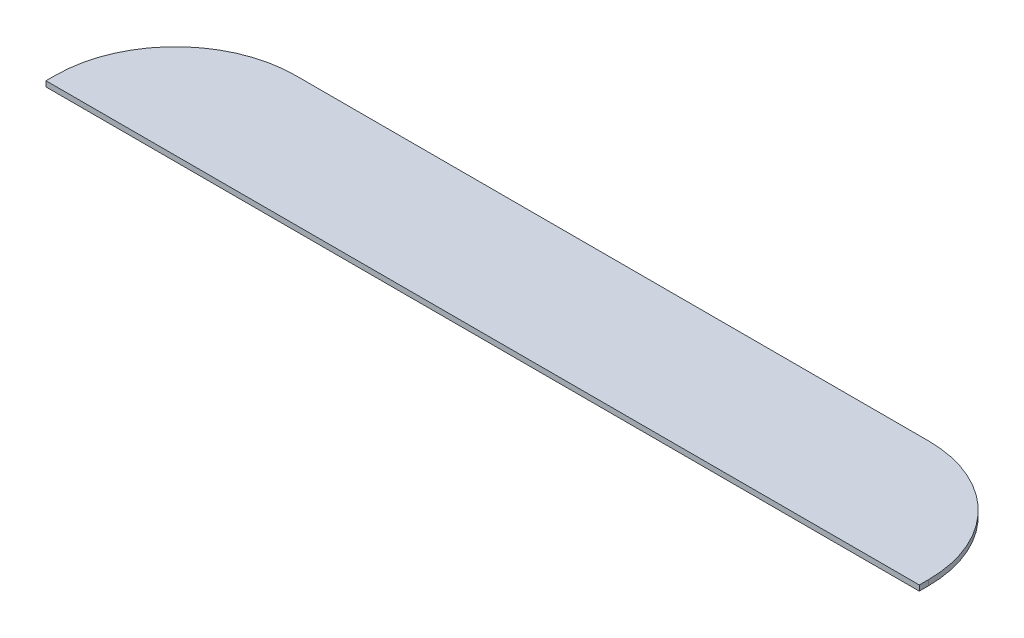
ISO-10303-21;
HEADER;
FILE_DESCRIPTION(('STEP AP214'),'2;1');
FILE_NAME('part.step','',(''),(''),'','','');
FILE_SCHEMA(('AUTOMOTIVE_DESIGN { 1 0 10303 214 1 1 1 1 }'));
ENDSEC;
DATA;
#1=APPLICATION_CONTEXT('core data for automotive mechanical design processes');
#2=APPLICATION_PROTOCOL_DEFINITION('international standard','automotive_design',2000,#1);
#3=PRODUCT_CONTEXT('',#1,'mechanical');
#4=PRODUCT('Part','Part','',(#3));
#5=PRODUCT_RELATED_PRODUCT_CATEGORY('part','',(#4));
#6=PRODUCT_DEFINITION_FORMATION('','',#4);
#7=PRODUCT_DEFINITION_CONTEXT('part definition',#1,'design');
#8=PRODUCT_DEFINITION('design','',#6,#7);
#9=PRODUCT_DEFINITION_SHAPE('','',#8);
#10=(LENGTH_UNIT() NAMED_UNIT(*) SI_UNIT(.MILLI.,.METRE.));
#11=(NAMED_UNIT(*) PLANE_ANGLE_UNIT() SI_UNIT($,.RADIAN.));
#12=(NAMED_UNIT(*) SI_UNIT($,.STERADIAN.) SOLID_ANGLE_UNIT());
#13=UNCERTAINTY_MEASURE_WITH_UNIT(LENGTH_MEASURE(1.E-05),#10,'distance_accuracy_value','');
#14=(GEOMETRIC_REPRESENTATION_CONTEXT(3) GLOBAL_UNCERTAINTY_ASSIGNED_CONTEXT((#13)) GLOBAL_UNIT_ASSIGNED_CONTEXT((#10,
#11,#12)) REPRESENTATION_CONTEXT('',''));
#15=CARTESIAN_POINT('',(0.,0.,0.));
#16=DIRECTION('',(0.,0.,1.));
#17=DIRECTION('',(1.,0.,0.));
#18=AXIS2_PLACEMENT_3D('',#15,#16,#17);
#19=CARTESIAN_POINT('',(-257.175,3.175,0.));
#20=DIRECTION('',(1.,0.,0.));
#21=DIRECTION('',(0.,0.,-1.));
#22=AXIS2_PLACEMENT_3D('',#19,#20,#21);
#23=PLANE('',#22);
#24=DIRECTION('',(0.,0.,1.));
#25=VECTOR('',#24,1.);
#26=CARTESIAN_POINT('',(-257.175,0.,0.));
#27=LINE('',#26,#25);
#28=CARTESIAN_POINT('',(-257.175,0.,-5.3999999999995));
#29=VERTEX_POINT('',#28);
#30=CARTESIAN_POINT('',(-257.175,0.,0.));
#31=VERTEX_POINT('',#30);
#32=EDGE_CURVE('E132',#29,#31,#27,.T.);
#33=ORIENTED_EDGE('',*,*,#32,.T.);
#34=DIRECTION('',(0.,-1.,0.));
#35=VECTOR('',#34,1.);
#36=CARTESIAN_POINT('',(-257.175,3.175,0.));
#37=LINE('',#36,#35);
#38=CARTESIAN_POINT('',(-257.175,3.175,0.));
#39=VERTEX_POINT('',#38);
#40=EDGE_CURVE('E11',#39,#31,#37,.T.);
#41=ORIENTED_EDGE('',*,*,#40,.F.);
#42=DIRECTION('',(0.,0.,1.));
#43=VECTOR('',#42,1.);
#44=CARTESIAN_POINT('',(-257.175,3.175,0.));
#45=LINE('',#44,#43);
#46=CARTESIAN_POINT('',(-257.175,3.175,-5.3999999999995));
#47=VERTEX_POINT('',#46);
#48=EDGE_CURVE('E148',#47,#39,#45,.T.);
#49=ORIENTED_EDGE('',*,*,#48,.F.);
#50=DIRECTION('',(0.,-1.,0.));
#51=VECTOR('',#50,1.);
#52=CARTESIAN_POINT('',(-257.175,3.175,-5.3999999999995));
#53=LINE('',#52,#51);
#54=EDGE_CURVE('E128',#47,#29,#53,.T.);
#55=ORIENTED_EDGE('',*,*,#54,.T.);
#56=EDGE_LOOP('',(#33,#41,#49,#55));
#57=FACE_BOUND('',#56,.T.);
#58=ADVANCED_FACE('F43',(#57),#23,.F.);
#59=CARTESIAN_POINT('',(-257.175,3.175,0.));
#60=DIRECTION('',(0.,0.,-1.));
#61=DIRECTION('',(-1.,0.,0.));
#62=AXIS2_PLACEMENT_3D('',#59,#60,#61);
#63=PLANE('',#62);
#64=DIRECTION('',(1.,0.,0.));
#65=VECTOR('',#64,1.);
#66=CARTESIAN_POINT('',(-257.175,0.,0.));
#67=LINE('',#66,#65);
#68=CARTESIAN_POINT('',(257.175,0.,0.));
#69=VERTEX_POINT('',#68);
#70=EDGE_CURVE('E136',#31,#69,#67,.T.);
#71=ORIENTED_EDGE('',*,*,#70,.T.);
#72=DIRECTION('',(0.,-1.,0.));
#73=VECTOR('',#72,1.);
#74=CARTESIAN_POINT('',(257.175,3.175,0.));
#75=LINE('',#74,#73);
#76=CARTESIAN_POINT('',(257.175,3.175,0.));
#77=VERTEX_POINT('',#76);
#78=EDGE_CURVE('E52',#77,#69,#75,.T.);
#79=ORIENTED_EDGE('',*,*,#78,.F.);
#80=DIRECTION('',(1.,0.,0.));
#81=VECTOR('',#80,1.);
#82=CARTESIAN_POINT('',(-257.175,3.175,0.));
#83=LINE('',#82,#81);
#84=EDGE_CURVE('E97',#39,#77,#83,.T.);
#85=ORIENTED_EDGE('',*,*,#84,.F.);
#86=ORIENTED_EDGE('',*,*,#40,.T.);
#87=EDGE_LOOP('',(#71,#79,#85,#86));
#88=FACE_BOUND('',#87,.T.);
#89=ADVANCED_FACE('F176',(#88),#63,.F.);
#90=CARTESIAN_POINT('',(257.175,3.175,-5.3999999999996));
#91=DIRECTION('',(-1.,0.,0.));
#92=DIRECTION('',(0.,0.,1.));
#93=AXIS2_PLACEMENT_3D('',#90,#91,#92);
#94=PLANE('',#93);
#95=DIRECTION('',(0.,0.,-1.));
#96=VECTOR('',#95,1.);
#97=CARTESIAN_POINT('',(257.175,0.,-5.3999999999996));
#98=LINE('',#97,#96);
#99=CARTESIAN_POINT('',(257.175,0.,-5.3999999999996));
#100=VERTEX_POINT('',#99);
#101=EDGE_CURVE('E139',#69,#100,#98,.T.);
#102=ORIENTED_EDGE('',*,*,#101,.T.);
#103=DIRECTION('',(0.,-1.,0.));
#104=VECTOR('',#103,1.);
#105=CARTESIAN_POINT('',(257.175,3.175,-5.3999999999996));
#106=LINE('',#105,#104);
#107=CARTESIAN_POINT('',(257.175,3.175,-5.3999999999996));
#108=VERTEX_POINT('',#107);
#109=EDGE_CURVE('E121',#108,#100,#106,.T.);
#110=ORIENTED_EDGE('',*,*,#109,.F.);
#111=DIRECTION('',(0.,0.,-1.));
#112=VECTOR('',#111,1.);
#113=CARTESIAN_POINT('',(257.175,3.175,-5.3999999999996));
#114=LINE('',#113,#112);
#115=EDGE_CURVE('E110',#77,#108,#114,.T.);
#116=ORIENTED_EDGE('',*,*,#115,.F.);
#117=ORIENTED_EDGE('',*,*,#78,.T.);
#118=EDGE_LOOP('',(#102,#110,#116,#117));
#119=FACE_BOUND('',#118,.T.);
#120=ADVANCED_FACE('F158',(#119),#94,.F.);
#121=CARTESIAN_POINT('',(186.375,3.175,-5.4000000000001));
#122=DIRECTION('',(0.,-1.,0.));
#123=DIRECTION('',(0.,0.,-1.));
#124=AXIS2_PLACEMENT_3D('',#121,#122,#123);
#125=CYLINDRICAL_SURFACE('',#124,70.8);
#126=CARTESIAN_POINT('',(186.375,0.,-5.4000000000001));
#127=DIRECTION('',(0.,1.,0.));
#128=DIRECTION('',(0.,0.,-1.));
#129=AXIS2_PLACEMENT_3D('',#126,#127,#128);
#130=CIRCLE('',#129,70.8);
#131=CARTESIAN_POINT('',(186.374999999999,0.,-76.2000000000001));
#132=VERTEX_POINT('',#131);
#133=EDGE_CURVE('E119',#100,#132,#130,.T.);
#134=ORIENTED_EDGE('',*,*,#133,.T.);
#135=DIRECTION('',(0.,-1.,0.));
#136=VECTOR('',#135,1.);
#137=CARTESIAN_POINT('',(186.374999999999,3.175,-76.2000000000001));
#138=LINE('',#137,#136);
#139=CARTESIAN_POINT('',(186.374999999999,3.175,-76.2000000000001));
#140=VERTEX_POINT('',#139);
#141=EDGE_CURVE('E116',#140,#132,#138,.T.);
#142=ORIENTED_EDGE('',*,*,#141,.F.);
#143=CARTESIAN_POINT('',(186.375,3.175,-5.4000000000001));
#144=DIRECTION('',(0.,1.,0.));
#145=DIRECTION('',(0.,0.,-1.));
#146=AXIS2_PLACEMENT_3D('',#143,#144,#145);
#147=CIRCLE('',#146,70.8);
#148=EDGE_CURVE('E104',#108,#140,#147,.T.);
#149=ORIENTED_EDGE('',*,*,#148,.F.);
#150=ORIENTED_EDGE('',*,*,#109,.T.);
#151=EDGE_LOOP('',(#134,#142,#149,#150));
#152=FACE_BOUND('',#151,.T.);
#153=ADVANCED_FACE('F117',(#152),#125,.T.);
#154=CARTESIAN_POINT('',(-186.375,3.175,-76.2));
#155=DIRECTION('',(0.,0.,1.));
#156=DIRECTION('',(1.,0.,0.));
#157=AXIS2_PLACEMENT_3D('',#154,#155,#156);
#158=PLANE('',#157);
#159=DIRECTION('',(-1.,0.,0.));
#160=VECTOR('',#159,1.);
#161=CARTESIAN_POINT('',(-186.375,0.,-76.2));
#162=LINE('',#161,#160);
#163=CARTESIAN_POINT('',(-186.375,0.,-76.2));
#164=VERTEX_POINT('',#163);
#165=EDGE_CURVE('E83',#132,#164,#162,.T.);
#166=ORIENTED_EDGE('',*,*,#165,.T.);
#167=DIRECTION('',(0.,-1.,0.));
#168=VECTOR('',#167,1.);
#169=CARTESIAN_POINT('',(-186.375,3.175,-76.2));
#170=LINE('',#169,#168);
#171=CARTESIAN_POINT('',(-186.375,3.175,-76.2));
#172=VERTEX_POINT('',#171);
#173=EDGE_CURVE('E122',#172,#164,#170,.T.);
#174=ORIENTED_EDGE('',*,*,#173,.F.);
#175=DIRECTION('',(-1.,0.,0.));
#176=VECTOR('',#175,1.);
#177=CARTESIAN_POINT('',(-186.375,3.175,-76.2));
#178=LINE('',#177,#176);
#179=EDGE_CURVE('E108',#140,#172,#178,.T.);
#180=ORIENTED_EDGE('',*,*,#179,.F.);
#181=ORIENTED_EDGE('',*,*,#141,.T.);
#182=EDGE_LOOP('',(#166,#174,#180,#181));
#183=FACE_BOUND('',#182,.T.);
#184=ADVANCED_FACE('F124',(#183),#158,.F.);
#185=CARTESIAN_POINT('',(-186.375,3.175,-5.40000000000002));
#186=DIRECTION('',(0.,-1.,0.));
#187=DIRECTION('',(0.,0.,-1.));
#188=AXIS2_PLACEMENT_3D('',#185,#186,#187);
#189=CYLINDRICAL_SURFACE('',#188,70.8);
#190=CARTESIAN_POINT('',(-186.375,0.,-5.40000000000002));
#191=DIRECTION('',(0.,1.,0.));
#192=DIRECTION('',(0.,0.,-1.));
#193=AXIS2_PLACEMENT_3D('',#190,#191,#192);
#194=CIRCLE('',#193,70.8);
#195=EDGE_CURVE('E89',#164,#29,#194,.T.);
#196=ORIENTED_EDGE('',*,*,#195,.T.);
#197=ORIENTED_EDGE('',*,*,#54,.F.);
#198=CARTESIAN_POINT('',(-186.375,3.175,-5.40000000000002));
#199=DIRECTION('',(0.,1.,0.));
#200=DIRECTION('',(0.,0.,-1.));
#201=AXIS2_PLACEMENT_3D('',#198,#199,#200);
#202=CIRCLE('',#201,70.8);
#203=EDGE_CURVE('E60',#172,#47,#202,.T.);
#204=ORIENTED_EDGE('',*,*,#203,.F.);
#205=ORIENTED_EDGE('',*,*,#173,.T.);
#206=EDGE_LOOP('',(#196,#197,#204,#205));
#207=FACE_BOUND('',#206,.T.);
#208=ADVANCED_FACE('F165',(#207),#189,.T.);
#209=CARTESIAN_POINT('',(-186.375,3.175,-5.40000000000002));
#210=DIRECTION('',(0.,-1.,0.));
#211=DIRECTION('',(0.,0.,-1.));
#212=AXIS2_PLACEMENT_3D('',#209,#210,#211);
#213=PLANE('',#212);
#214=ORIENTED_EDGE('',*,*,#48,.T.);
#215=ORIENTED_EDGE('',*,*,#84,.T.);
#216=ORIENTED_EDGE('',*,*,#115,.T.);
#217=ORIENTED_EDGE('',*,*,#148,.T.);
#218=ORIENTED_EDGE('',*,*,#179,.T.);
#219=ORIENTED_EDGE('',*,*,#203,.T.);
#220=EDGE_LOOP('',(#214,#215,#216,#217,#218,#219));
#221=FACE_BOUND('',#220,.T.);
#222=ADVANCED_FACE('F106',(#221),#213,.F.);
#223=CARTESIAN_POINT('',(-186.375,0.,-5.40000000000002));
#224=DIRECTION('',(0.,-1.,0.));
#225=DIRECTION('',(0.,0.,-1.));
#226=AXIS2_PLACEMENT_3D('',#223,#224,#225);
#227=PLANE('',#226);
#228=ORIENTED_EDGE('',*,*,#32,.F.);
#229=ORIENTED_EDGE('',*,*,#195,.F.);
#230=ORIENTED_EDGE('',*,*,#165,.F.);
#231=ORIENTED_EDGE('',*,*,#133,.F.);
#232=ORIENTED_EDGE('',*,*,#101,.F.);
#233=ORIENTED_EDGE('',*,*,#70,.F.);
#234=EDGE_LOOP('',(#228,#229,#230,#231,#232,#233));
#235=FACE_BOUND('',#234,.T.);
#236=ADVANCED_FACE('F161',(#235),#227,.T.);
#237=CLOSED_SHELL('',(#58,#89,#120,#153,#184,#208,#222,#236));
#238=MANIFOLD_SOLID_BREP('B2',#237);
#239=ADVANCED_BREP_SHAPE_REPRESENTATION('',(#18,#238),#14);
#240=SHAPE_DEFINITION_REPRESENTATION(#9,#239);
ENDSEC;
END-ISO-10303-21;
